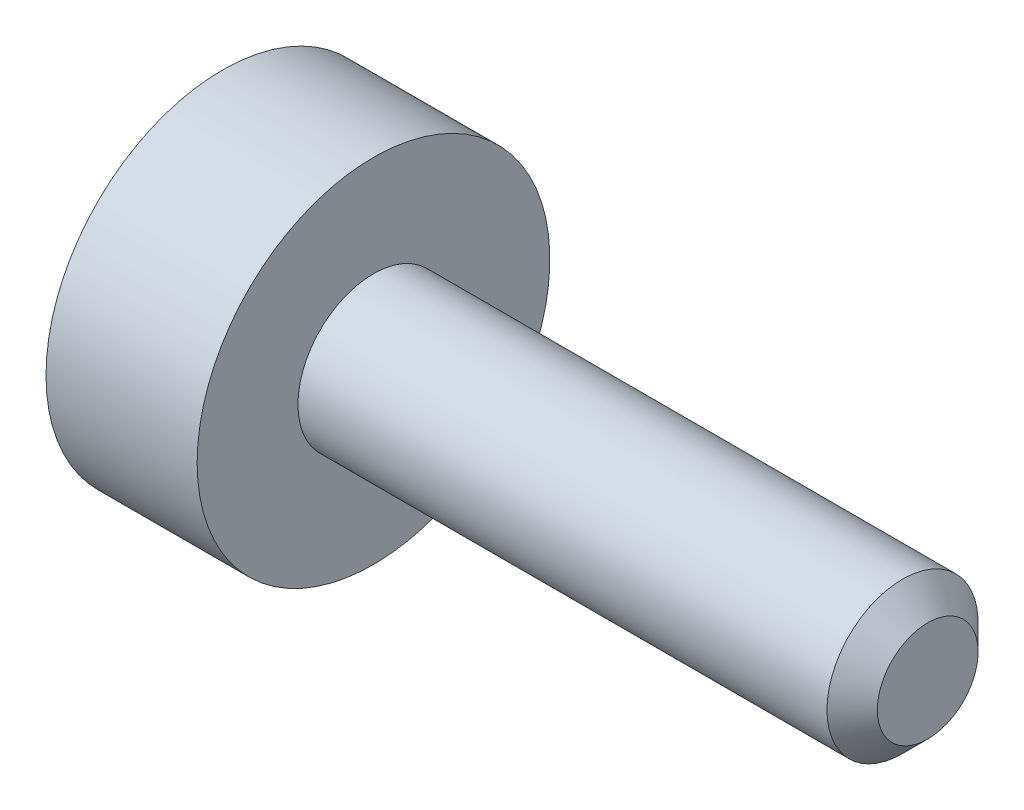
ISO-10303-21;
HEADER;
FILE_DESCRIPTION(('STEP AP214'),'2;1');
FILE_NAME('part.step','',(''),(''),'','','');
FILE_SCHEMA(('AUTOMOTIVE_DESIGN { 1 0 10303 214 1 1 1 1 }'));
ENDSEC;
DATA;
#1=APPLICATION_CONTEXT('core data for automotive mechanical design processes');
#2=APPLICATION_PROTOCOL_DEFINITION('international standard','automotive_design',2000,#1);
#3=PRODUCT_CONTEXT('',#1,'mechanical');
#4=PRODUCT('Part','Part','',(#3));
#5=PRODUCT_RELATED_PRODUCT_CATEGORY('part','',(#4));
#6=PRODUCT_DEFINITION_FORMATION('','',#4);
#7=PRODUCT_DEFINITION_CONTEXT('part definition',#1,'design');
#8=PRODUCT_DEFINITION('design','',#6,#7);
#9=PRODUCT_DEFINITION_SHAPE('','',#8);
#10=(LENGTH_UNIT() NAMED_UNIT(*) SI_UNIT(.MILLI.,.METRE.));
#11=(NAMED_UNIT(*) PLANE_ANGLE_UNIT() SI_UNIT($,.RADIAN.));
#12=(NAMED_UNIT(*) SI_UNIT($,.STERADIAN.) SOLID_ANGLE_UNIT());
#13=UNCERTAINTY_MEASURE_WITH_UNIT(LENGTH_MEASURE(1.E-05),#10,'distance_accuracy_value','');
#14=(GEOMETRIC_REPRESENTATION_CONTEXT(3) GLOBAL_UNCERTAINTY_ASSIGNED_CONTEXT((#13)) GLOBAL_UNIT_ASSIGNED_CONTEXT((#10,
#11,#12)) REPRESENTATION_CONTEXT('',''));
#15=CARTESIAN_POINT('',(0.,0.,0.));
#16=DIRECTION('',(0.,0.,1.));
#17=DIRECTION('',(1.,0.,0.));
#18=AXIS2_PLACEMENT_3D('',#15,#16,#17);
#19=CARTESIAN_POINT('',(0.,0.,0.));
#20=DIRECTION('',(-1.,0.,0.));
#21=DIRECTION('',(0.,0.,1.));
#22=AXIS2_PLACEMENT_3D('',#19,#20,#21);
#23=PLANE('',#22);
#24=CARTESIAN_POINT('',(0.,0.,0.));
#25=DIRECTION('',(-1.,0.,0.));
#26=DIRECTION('',(0.,0.,1.));
#27=AXIS2_PLACEMENT_3D('',#24,#25,#26);
#28=CIRCLE('',#27,1.);
#29=CARTESIAN_POINT('',(0.,0.,1.));
#30=VERTEX_POINT('',#29);
#31=EDGE_CURVE('E11',#30,#30,#28,.T.);
#32=ORIENTED_EDGE('',*,*,#31,.F.);
#33=EDGE_LOOP('',(#32));
#34=FACE_BOUND('',#33,.T.);
#35=ADVANCED_FACE('F43',(#34),#23,.F.);
#36=CARTESIAN_POINT('',(0.,0.,0.));
#37=DIRECTION('',(-1.,0.,0.));
#38=DIRECTION('',(0.,0.,1.));
#39=AXIS2_PLACEMENT_3D('',#36,#37,#38);
#40=CONICAL_SURFACE('',#39,1.,0.785398163397448);
#41=CARTESIAN_POINT('',(-0.5,0.,0.));
#42=DIRECTION('',(-1.,0.,0.));
#43=DIRECTION('',(0.,0.,1.));
#44=AXIS2_PLACEMENT_3D('',#41,#42,#43);
#45=CIRCLE('',#44,1.5);
#46=CARTESIAN_POINT('',(-0.5,0.,1.5));
#47=VERTEX_POINT('',#46);
#48=EDGE_CURVE('E51',#47,#47,#45,.T.);
#49=ORIENTED_EDGE('',*,*,#48,.F.);
#50=EDGE_LOOP('',(#49));
#51=FACE_BOUND('',#50,.T.);
#52=ORIENTED_EDGE('',*,*,#31,.T.);
#53=EDGE_LOOP('',(#52));
#54=FACE_BOUND('',#53,.T.);
#55=ADVANCED_FACE('F183',(#51,#54),#40,.T.);
#56=CARTESIAN_POINT('',(0.,0.,0.));
#57=DIRECTION('',(-1.,0.,0.));
#58=DIRECTION('',(0.,0.,1.));
#59=AXIS2_PLACEMENT_3D('',#56,#57,#58);
#60=CYLINDRICAL_SURFACE('',#59,1.5);
#61=CARTESIAN_POINT('',(-11.,0.,0.));
#62=DIRECTION('',(-1.,0.,0.));
#63=DIRECTION('',(0.,0.,1.));
#64=AXIS2_PLACEMENT_3D('',#61,#62,#63);
#65=CIRCLE('',#64,1.5);
#66=CARTESIAN_POINT('',(-11.,0.,1.5));
#67=VERTEX_POINT('',#66);
#68=EDGE_CURVE('E174',#67,#67,#65,.T.);
#69=ORIENTED_EDGE('',*,*,#68,.F.);
#70=EDGE_LOOP('',(#69));
#71=FACE_BOUND('',#70,.T.);
#72=ORIENTED_EDGE('',*,*,#48,.T.);
#73=EDGE_LOOP('',(#72));
#74=FACE_BOUND('',#73,.T.);
#75=ADVANCED_FACE('F181',(#71,#74),#60,.T.);
#76=CARTESIAN_POINT('',(-11.,1.5,0.));
#77=DIRECTION('',(-1.,0.,0.));
#78=DIRECTION('',(0.,0.,1.));
#79=AXIS2_PLACEMENT_3D('',#76,#77,#78);
#80=PLANE('',#79);
#81=CARTESIAN_POINT('',(-11.,0.,0.));
#82=DIRECTION('',(-1.,0.,0.));
#83=DIRECTION('',(0.,0.,1.));
#84=AXIS2_PLACEMENT_3D('',#81,#82,#83);
#85=CIRCLE('',#84,3.5);
#86=CARTESIAN_POINT('',(-11.,0.,3.5));
#87=VERTEX_POINT('',#86);
#88=EDGE_CURVE('E170',#87,#87,#85,.T.);
#89=ORIENTED_EDGE('',*,*,#88,.F.);
#90=EDGE_LOOP('',(#89));
#91=FACE_BOUND('',#90,.T.);
#92=ORIENTED_EDGE('',*,*,#68,.T.);
#93=EDGE_LOOP('',(#92));
#94=FACE_BOUND('',#93,.T.);
#95=ADVANCED_FACE('F201',(#91,#94),#80,.F.);
#96=CARTESIAN_POINT('',(0.,0.,0.));
#97=DIRECTION('',(-1.,0.,0.));
#98=DIRECTION('',(0.,0.,1.));
#99=AXIS2_PLACEMENT_3D('',#96,#97,#98);
#100=CYLINDRICAL_SURFACE('',#99,3.5);
#101=CARTESIAN_POINT('',(-14.,0.,0.));
#102=DIRECTION('',(-1.,0.,0.));
#103=DIRECTION('',(0.,0.,1.));
#104=AXIS2_PLACEMENT_3D('',#101,#102,#103);
#105=CIRCLE('',#104,3.5);
#106=CARTESIAN_POINT('',(-14.,0.,3.5));
#107=VERTEX_POINT('',#106);
#108=EDGE_CURVE('E157',#107,#107,#105,.T.);
#109=ORIENTED_EDGE('',*,*,#108,.F.);
#110=EDGE_LOOP('',(#109));
#111=FACE_BOUND('',#110,.T.);
#112=ORIENTED_EDGE('',*,*,#88,.T.);
#113=EDGE_LOOP('',(#112));
#114=FACE_BOUND('',#113,.T.);
#115=ADVANCED_FACE('F209',(#111,#114),#100,.T.);
#116=CARTESIAN_POINT('',(-14.,3.5,0.));
#117=DIRECTION('',(1.,0.,0.));
#118=DIRECTION('',(0.,0.,-1.));
#119=AXIS2_PLACEMENT_3D('',#116,#117,#118);
#120=PLANE('',#119);
#121=DIRECTION('',(0.,-0.5,-0.866025403784439));
#122=VECTOR('',#121,1.);
#123=CARTESIAN_POINT('',(-14.,1.73205080756888,0.));
#124=LINE('',#123,#122);
#125=CARTESIAN_POINT('',(-14.,1.73205080756888,0.));
#126=VERTEX_POINT('',#125);
#127=CARTESIAN_POINT('',(-14.,0.86602540378444,-1.5));
#128=VERTEX_POINT('',#127);
#129=EDGE_CURVE('E138',#126,#128,#124,.T.);
#130=ORIENTED_EDGE('',*,*,#129,.F.);
#131=DIRECTION('',(0.,0.5,-0.866025403784439));
#132=VECTOR('',#131,1.);
#133=CARTESIAN_POINT('',(-14.,0.86602540378444,1.5));
#134=LINE('',#133,#132);
#135=CARTESIAN_POINT('',(-14.,0.86602540378444,1.5));
#136=VERTEX_POINT('',#135);
#137=EDGE_CURVE('E58',#136,#126,#134,.T.);
#138=ORIENTED_EDGE('',*,*,#137,.F.);
#139=DIRECTION('',(0.,1.,0.));
#140=VECTOR('',#139,1.);
#141=CARTESIAN_POINT('',(-14.,-0.866025403784439,1.5));
#142=LINE('',#141,#140);
#143=CARTESIAN_POINT('',(-14.,-0.866025403784439,1.5));
#144=VERTEX_POINT('',#143);
#145=EDGE_CURVE('E151',#144,#136,#142,.T.);
#146=ORIENTED_EDGE('',*,*,#145,.F.);
#147=DIRECTION('',(0.,0.5,0.866025403784439));
#148=VECTOR('',#147,1.);
#149=CARTESIAN_POINT('',(-14.,-1.73205080756888,0.));
#150=LINE('',#149,#148);
#151=CARTESIAN_POINT('',(-14.,-1.73205080756888,0.));
#152=VERTEX_POINT('',#151);
#153=EDGE_CURVE('E148',#152,#144,#150,.T.);
#154=ORIENTED_EDGE('',*,*,#153,.F.);
#155=DIRECTION('',(0.,-0.5,0.866025403784438));
#156=VECTOR('',#155,1.);
#157=CARTESIAN_POINT('',(-14.,-0.866025403784438,-1.5));
#158=LINE('',#157,#156);
#159=CARTESIAN_POINT('',(-14.,-0.866025403784438,-1.5));
#160=VERTEX_POINT('',#159);
#161=EDGE_CURVE('E106',#160,#152,#158,.T.);
#162=ORIENTED_EDGE('',*,*,#161,.F.);
#163=DIRECTION('',(0.,-1.,0.));
#164=VECTOR('',#163,1.);
#165=CARTESIAN_POINT('',(-14.,0.86602540378444,-1.5));
#166=LINE('',#165,#164);
#167=EDGE_CURVE('E142',#128,#160,#166,.T.);
#168=ORIENTED_EDGE('',*,*,#167,.F.);
#169=EDGE_LOOP('',(#130,#138,#146,#154,#162,#168));
#170=FACE_BOUND('',#169,.T.);
#171=ORIENTED_EDGE('',*,*,#108,.T.);
#172=EDGE_LOOP('',(#171));
#173=FACE_BOUND('',#172,.T.);
#174=ADVANCED_FACE('F217',(#170,#173),#120,.F.);
#175=CARTESIAN_POINT('',(-12.5,0.86602540378444,1.5));
#176=DIRECTION('',(0.,0.866025403784439,0.5));
#177=DIRECTION('',(0.,-0.5,0.866025403784439));
#178=AXIS2_PLACEMENT_3D('',#175,#176,#177);
#179=PLANE('',#178);
#180=ORIENTED_EDGE('',*,*,#137,.T.);
#181=DIRECTION('',(-1.,0.,0.));
#182=VECTOR('',#181,1.);
#183=CARTESIAN_POINT('',(-12.5,1.73205080756888,0.));
#184=LINE('',#183,#182);
#185=CARTESIAN_POINT('',(-12.5,1.73205080756888,0.));
#186=VERTEX_POINT('',#185);
#187=EDGE_CURVE('E88',#186,#126,#184,.T.);
#188=ORIENTED_EDGE('',*,*,#187,.F.);
#189=DIRECTION('',(0.,0.5,-0.866025403784439));
#190=VECTOR('',#189,1.);
#191=CARTESIAN_POINT('',(-12.5,0.86602540378444,1.5));
#192=LINE('',#191,#190);
#193=CARTESIAN_POINT('',(-12.5,0.86602540378444,1.5));
#194=VERTEX_POINT('',#193);
#195=EDGE_CURVE('E154',#194,#186,#192,.T.);
#196=ORIENTED_EDGE('',*,*,#195,.F.);
#197=DIRECTION('',(-1.,0.,0.));
#198=VECTOR('',#197,1.);
#199=CARTESIAN_POINT('',(-12.5,0.86602540378444,1.5));
#200=LINE('',#199,#198);
#201=EDGE_CURVE('E66',#194,#136,#200,.T.);
#202=ORIENTED_EDGE('',*,*,#201,.T.);
#203=EDGE_LOOP('',(#180,#188,#196,#202));
#204=FACE_BOUND('',#203,.T.);
#205=ADVANCED_FACE('F225',(#204),#179,.F.);
#206=CARTESIAN_POINT('',(-12.5,-0.866025403784439,1.5));
#207=DIRECTION('',(0.,0.,1.));
#208=DIRECTION('',(0.,-1.,0.));
#209=AXIS2_PLACEMENT_3D('',#206,#207,#208);
#210=PLANE('',#209);
#211=ORIENTED_EDGE('',*,*,#145,.T.);
#212=ORIENTED_EDGE('',*,*,#201,.F.);
#213=DIRECTION('',(0.,1.,0.));
#214=VECTOR('',#213,1.);
#215=CARTESIAN_POINT('',(-12.5,-0.866025403784439,1.5));
#216=LINE('',#215,#214);
#217=CARTESIAN_POINT('',(-12.5,-0.866025403784439,1.5));
#218=VERTEX_POINT('',#217);
#219=EDGE_CURVE('E120',#218,#194,#216,.T.);
#220=ORIENTED_EDGE('',*,*,#219,.F.);
#221=DIRECTION('',(-1.,0.,0.));
#222=VECTOR('',#221,1.);
#223=CARTESIAN_POINT('',(-12.5,-0.866025403784439,1.5));
#224=LINE('',#223,#222);
#225=EDGE_CURVE('E111',#218,#144,#224,.T.);
#226=ORIENTED_EDGE('',*,*,#225,.T.);
#227=EDGE_LOOP('',(#211,#212,#220,#226));
#228=FACE_BOUND('',#227,.T.);
#229=ADVANCED_FACE('F233',(#228),#210,.F.);
#230=CARTESIAN_POINT('',(-12.5,-1.73205080756888,0.));
#231=DIRECTION('',(0.,-0.866025403784439,0.5));
#232=DIRECTION('',(0.,-0.5,-0.866025403784439));
#233=AXIS2_PLACEMENT_3D('',#230,#231,#232);
#234=PLANE('',#233);
#235=ORIENTED_EDGE('',*,*,#153,.T.);
#236=ORIENTED_EDGE('',*,*,#225,.F.);
#237=DIRECTION('',(0.,0.5,0.866025403784439));
#238=VECTOR('',#237,1.);
#239=CARTESIAN_POINT('',(-12.5,-1.73205080756888,0.));
#240=LINE('',#239,#238);
#241=CARTESIAN_POINT('',(-12.5,-1.73205080756888,0.));
#242=VERTEX_POINT('',#241);
#243=EDGE_CURVE('E115',#242,#218,#240,.T.);
#244=ORIENTED_EDGE('',*,*,#243,.F.);
#245=DIRECTION('',(-1.,0.,0.));
#246=VECTOR('',#245,1.);
#247=CARTESIAN_POINT('',(-12.5,-1.73205080756888,0.));
#248=LINE('',#247,#246);
#249=EDGE_CURVE('E99',#242,#152,#248,.T.);
#250=ORIENTED_EDGE('',*,*,#249,.T.);
#251=EDGE_LOOP('',(#235,#236,#244,#250));
#252=FACE_BOUND('',#251,.T.);
#253=ADVANCED_FACE('F116',(#252),#234,.F.);
#254=CARTESIAN_POINT('',(-12.5,-0.866025403784438,-1.5));
#255=DIRECTION('',(0.,-0.866025403784439,-0.5));
#256=DIRECTION('',(0.,0.5,-0.866025403784439));
#257=AXIS2_PLACEMENT_3D('',#254,#255,#256);
#258=PLANE('',#257);
#259=ORIENTED_EDGE('',*,*,#161,.T.);
#260=ORIENTED_EDGE('',*,*,#249,.F.);
#261=DIRECTION('',(0.,-0.5,0.866025403784438));
#262=VECTOR('',#261,1.);
#263=CARTESIAN_POINT('',(-12.5,-0.866025403784438,-1.5));
#264=LINE('',#263,#262);
#265=CARTESIAN_POINT('',(-12.5,-0.866025403784438,-1.5));
#266=VERTEX_POINT('',#265);
#267=EDGE_CURVE('E103',#266,#242,#264,.T.);
#268=ORIENTED_EDGE('',*,*,#267,.F.);
#269=DIRECTION('',(-1.,0.,0.));
#270=VECTOR('',#269,1.);
#271=CARTESIAN_POINT('',(-12.5,-0.866025403784438,-1.5));
#272=LINE('',#271,#270);
#273=EDGE_CURVE('E112',#266,#160,#272,.T.);
#274=ORIENTED_EDGE('',*,*,#273,.T.);
#275=EDGE_LOOP('',(#259,#260,#268,#274));
#276=FACE_BOUND('',#275,.T.);
#277=ADVANCED_FACE('F101',(#276),#258,.F.);
#278=CARTESIAN_POINT('',(-12.5,0.86602540378444,-1.5));
#279=DIRECTION('',(0.,0.,-1.));
#280=DIRECTION('',(-1.,0.,0.));
#281=AXIS2_PLACEMENT_3D('',#278,#279,#280);
#282=PLANE('',#281);
#283=ORIENTED_EDGE('',*,*,#167,.T.);
#284=ORIENTED_EDGE('',*,*,#273,.F.);
#285=DIRECTION('',(0.,-1.,0.));
#286=VECTOR('',#285,1.);
#287=CARTESIAN_POINT('',(-12.5,0.86602540378444,-1.5));
#288=LINE('',#287,#286);
#289=CARTESIAN_POINT('',(-12.5,0.86602540378444,-1.5));
#290=VERTEX_POINT('',#289);
#291=EDGE_CURVE('E126',#290,#266,#288,.T.);
#292=ORIENTED_EDGE('',*,*,#291,.F.);
#293=DIRECTION('',(-1.,0.,0.));
#294=VECTOR('',#293,1.);
#295=CARTESIAN_POINT('',(-12.5,0.86602540378444,-1.5));
#296=LINE('',#295,#294);
#297=EDGE_CURVE('E162',#290,#128,#296,.T.);
#298=ORIENTED_EDGE('',*,*,#297,.T.);
#299=EDGE_LOOP('',(#283,#284,#292,#298));
#300=FACE_BOUND('',#299,.T.);
#301=ADVANCED_FACE('F252',(#300),#282,.F.);
#302=CARTESIAN_POINT('',(-12.5,1.73205080756888,0.));
#303=DIRECTION('',(0.,0.866025403784439,-0.5));
#304=DIRECTION('',(0.,0.5,0.866025403784439));
#305=AXIS2_PLACEMENT_3D('',#302,#303,#304);
#306=PLANE('',#305);
#307=ORIENTED_EDGE('',*,*,#129,.T.);
#308=ORIENTED_EDGE('',*,*,#297,.F.);
#309=DIRECTION('',(0.,-0.5,-0.866025403784439));
#310=VECTOR('',#309,1.);
#311=CARTESIAN_POINT('',(-12.5,1.73205080756888,0.));
#312=LINE('',#311,#310);
#313=EDGE_CURVE('E130',#186,#290,#312,.T.);
#314=ORIENTED_EDGE('',*,*,#313,.F.);
#315=ORIENTED_EDGE('',*,*,#187,.T.);
#316=EDGE_LOOP('',(#307,#308,#314,#315));
#317=FACE_BOUND('',#316,.T.);
#318=ADVANCED_FACE('F259',(#317),#306,.F.);
#319=CARTESIAN_POINT('',(-12.5,0.,0.));
#320=DIRECTION('',(-1.,0.,0.));
#321=DIRECTION('',(0.,0.,1.));
#322=AXIS2_PLACEMENT_3D('',#319,#320,#321);
#323=PLANE('',#322);
#324=ORIENTED_EDGE('',*,*,#195,.T.);
#325=ORIENTED_EDGE('',*,*,#313,.T.);
#326=ORIENTED_EDGE('',*,*,#291,.T.);
#327=ORIENTED_EDGE('',*,*,#267,.T.);
#328=ORIENTED_EDGE('',*,*,#243,.T.);
#329=ORIENTED_EDGE('',*,*,#219,.T.);
#330=EDGE_LOOP('',(#324,#325,#326,#327,#328,#329));
#331=FACE_BOUND('',#330,.T.);
#332=ADVANCED_FACE('F123',(#331),#323,.T.);
#333=CLOSED_SHELL('',(#35,#55,#75,#95,#115,#174,#205,#229,#253,#277,#301,#318,#332));
#334=MANIFOLD_SOLID_BREP('B2',#333);
#335=ADVANCED_BREP_SHAPE_REPRESENTATION('',(#18,#334),#14);
#336=SHAPE_DEFINITION_REPRESENTATION(#9,#335);
ENDSEC;
END-ISO-10303-21;
